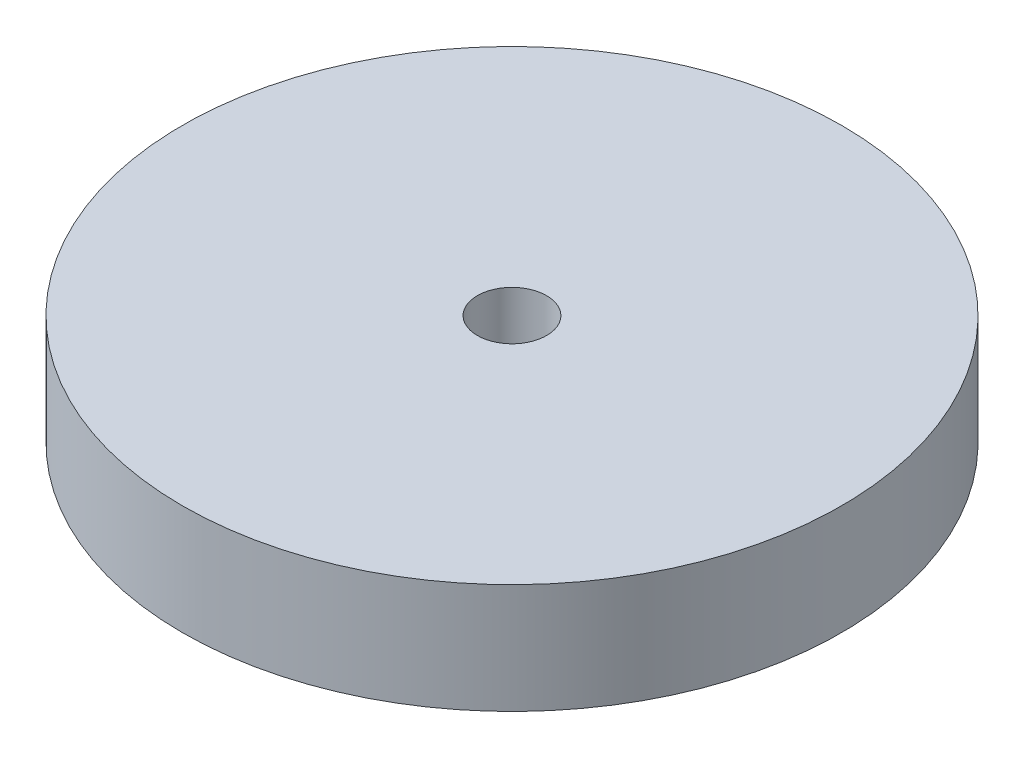
ISO-10303-21;
HEADER;
FILE_DESCRIPTION(('STEP AP214'),'2;1');
FILE_NAME('part.step','',(''),(''),'','','');
FILE_SCHEMA(('AUTOMOTIVE_DESIGN { 1 0 10303 214 1 1 1 1 }'));
ENDSEC;
DATA;
#1=APPLICATION_CONTEXT('core data for automotive mechanical design processes');
#2=APPLICATION_PROTOCOL_DEFINITION('international standard','automotive_design',2000,#1);
#3=PRODUCT_CONTEXT('',#1,'mechanical');
#4=PRODUCT('Part','Part','',(#3));
#5=PRODUCT_RELATED_PRODUCT_CATEGORY('part','',(#4));
#6=PRODUCT_DEFINITION_FORMATION('','',#4);
#7=PRODUCT_DEFINITION_CONTEXT('part definition',#1,'design');
#8=PRODUCT_DEFINITION('design','',#6,#7);
#9=PRODUCT_DEFINITION_SHAPE('','',#8);
#10=(LENGTH_UNIT() NAMED_UNIT(*) SI_UNIT(.MILLI.,.METRE.));
#11=(NAMED_UNIT(*) PLANE_ANGLE_UNIT() SI_UNIT($,.RADIAN.));
#12=(NAMED_UNIT(*) SI_UNIT($,.STERADIAN.) SOLID_ANGLE_UNIT());
#13=UNCERTAINTY_MEASURE_WITH_UNIT(LENGTH_MEASURE(1.E-05),#10,'distance_accuracy_value','');
#14=(GEOMETRIC_REPRESENTATION_CONTEXT(3) GLOBAL_UNCERTAINTY_ASSIGNED_CONTEXT((#13)) GLOBAL_UNIT_ASSIGNED_CONTEXT((#10,
#11,#12)) REPRESENTATION_CONTEXT('',''));
#15=CARTESIAN_POINT('',(0.,0.,0.));
#16=DIRECTION('',(0.,0.,1.));
#17=DIRECTION('',(1.,0.,0.));
#18=AXIS2_PLACEMENT_3D('',#15,#16,#17);
#19=CARTESIAN_POINT('',(0.,10.,0.));
#20=DIRECTION('',(0.,-1.,0.));
#21=DIRECTION('',(0.,0.,-1.));
#22=AXIS2_PLACEMENT_3D('',#19,#20,#21);
#23=CYLINDRICAL_SURFACE('',#22,30.);
#24=CARTESIAN_POINT('',(0.,10.,0.));
#25=DIRECTION('',(0.,1.,0.));
#26=DIRECTION('',(0.,0.,1.));
#27=AXIS2_PLACEMENT_3D('',#24,#25,#26);
#28=CIRCLE('',#27,30.);
#29=CARTESIAN_POINT('',(0.,10.,30.));
#30=VERTEX_POINT('',#29);
#31=EDGE_CURVE('E10',#30,#30,#28,.T.);
#32=ORIENTED_EDGE('',*,*,#31,.F.);
#33=EDGE_LOOP('',(#32));
#34=FACE_BOUND('',#33,.T.);
#35=CARTESIAN_POINT('',(0.,0.,0.));
#36=DIRECTION('',(0.,1.,0.));
#37=DIRECTION('',(0.,0.,1.));
#38=AXIS2_PLACEMENT_3D('',#35,#36,#37);
#39=CIRCLE('',#38,30.);
#40=CARTESIAN_POINT('',(0.,0.,30.));
#41=VERTEX_POINT('',#40);
#42=EDGE_CURVE('E35',#41,#41,#39,.T.);
#43=ORIENTED_EDGE('',*,*,#42,.T.);
#44=EDGE_LOOP('',(#43));
#45=FACE_BOUND('',#44,.T.);
#46=ADVANCED_FACE('F32',(#34,#45),#23,.T.);
#47=CARTESIAN_POINT('',(0.,10.,0.));
#48=DIRECTION('',(0.,1.,0.));
#49=DIRECTION('',(0.,0.,1.));
#50=AXIS2_PLACEMENT_3D('',#47,#48,#49);
#51=PLANE('',#50);
#52=CARTESIAN_POINT('',(0.,10.,0.));
#53=DIRECTION('',(0.,1.,0.));
#54=DIRECTION('',(0.,0.,1.));
#55=AXIS2_PLACEMENT_3D('',#52,#53,#54);
#56=CIRCLE('',#55,3.15);
#57=CARTESIAN_POINT('',(0.,10.,3.15));
#58=VERTEX_POINT('',#57);
#59=EDGE_CURVE('E44',#58,#58,#56,.T.);
#60=ORIENTED_EDGE('',*,*,#59,.F.);
#61=EDGE_LOOP('',(#60));
#62=FACE_BOUND('',#61,.T.);
#63=ORIENTED_EDGE('',*,*,#31,.T.);
#64=EDGE_LOOP('',(#63));
#65=FACE_BOUND('',#64,.T.);
#66=ADVANCED_FACE('F59',(#62,#65),#51,.T.);
#67=CARTESIAN_POINT('',(0.,0.,0.));
#68=DIRECTION('',(0.,1.,0.));
#69=DIRECTION('',(0.,0.,1.));
#70=AXIS2_PLACEMENT_3D('',#67,#68,#69);
#71=PLANE('',#70);
#72=CARTESIAN_POINT('',(0.,0.,0.));
#73=DIRECTION('',(0.,1.,0.));
#74=DIRECTION('',(0.,0.,1.));
#75=AXIS2_PLACEMENT_3D('',#72,#73,#74);
#76=CIRCLE('',#75,3.15);
#77=CARTESIAN_POINT('',(0.,0.,3.15));
#78=VERTEX_POINT('',#77);
#79=EDGE_CURVE('E42',#78,#78,#76,.T.);
#80=ORIENTED_EDGE('',*,*,#79,.T.);
#81=EDGE_LOOP('',(#80));
#82=FACE_BOUND('',#81,.T.);
#83=ORIENTED_EDGE('',*,*,#42,.F.);
#84=EDGE_LOOP('',(#83));
#85=FACE_BOUND('',#84,.T.);
#86=ADVANCED_FACE('F50',(#82,#85),#71,.F.);
#87=CARTESIAN_POINT('',(0.,0.,0.));
#88=DIRECTION('',(0.,1.,0.));
#89=DIRECTION('',(0.,0.,1.));
#90=AXIS2_PLACEMENT_3D('',#87,#88,#89);
#91=CYLINDRICAL_SURFACE('',#90,3.15);
#92=ORIENTED_EDGE('',*,*,#79,.F.);
#93=EDGE_LOOP('',(#92));
#94=FACE_BOUND('',#93,.T.);
#95=ORIENTED_EDGE('',*,*,#59,.T.);
#96=EDGE_LOOP('',(#95));
#97=FACE_BOUND('',#96,.T.);
#98=ADVANCED_FACE('F53',(#94,#97),#91,.F.);
#99=CLOSED_SHELL('',(#46,#66,#86,#98));
#100=MANIFOLD_SOLID_BREP('B2',#99);
#101=ADVANCED_BREP_SHAPE_REPRESENTATION('',(#18,#100),#14);
#102=SHAPE_DEFINITION_REPRESENTATION(#9,#101);
ENDSEC;
END-ISO-10303-21;
